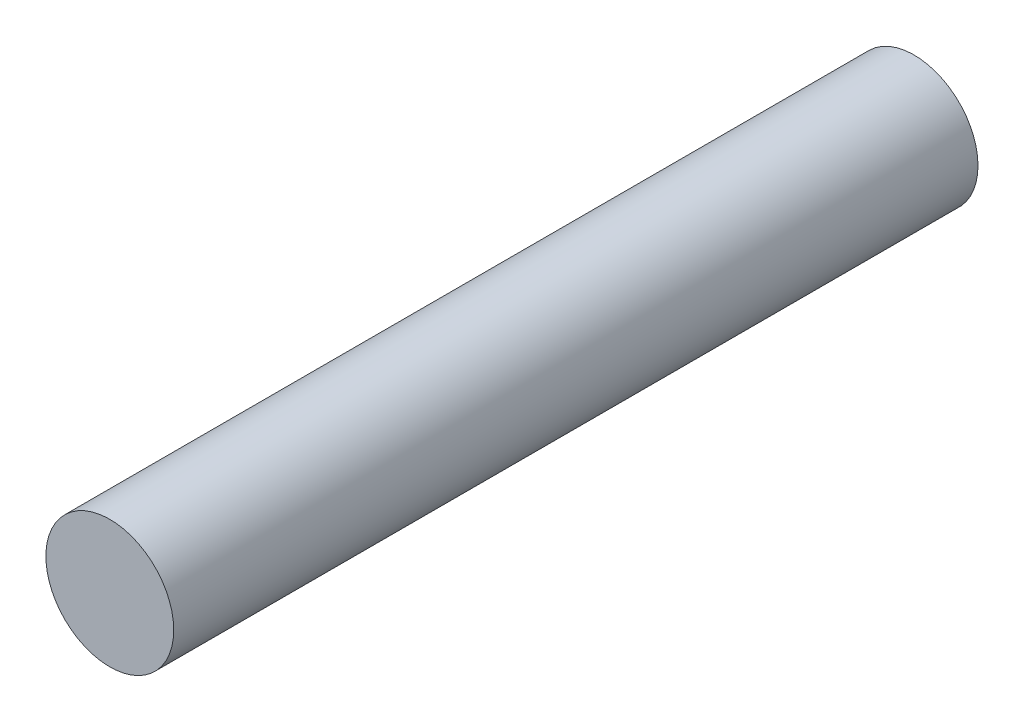
ISO-10303-21;
HEADER;
FILE_DESCRIPTION(('STEP AP214'),'2;1');
FILE_NAME('part.step','',(''),(''),'','','');
FILE_SCHEMA(('AUTOMOTIVE_DESIGN { 1 0 10303 214 1 1 1 1 }'));
ENDSEC;
DATA;
#1=APPLICATION_CONTEXT('core data for automotive mechanical design processes');
#2=APPLICATION_PROTOCOL_DEFINITION('international standard','automotive_design',2000,#1);
#3=PRODUCT_CONTEXT('',#1,'mechanical');
#4=PRODUCT('Part','Part','',(#3));
#5=PRODUCT_RELATED_PRODUCT_CATEGORY('part','',(#4));
#6=PRODUCT_DEFINITION_FORMATION('','',#4);
#7=PRODUCT_DEFINITION_CONTEXT('part definition',#1,'design');
#8=PRODUCT_DEFINITION('design','',#6,#7);
#9=PRODUCT_DEFINITION_SHAPE('','',#8);
#10=(LENGTH_UNIT() NAMED_UNIT(*) SI_UNIT(.MILLI.,.METRE.));
#11=(NAMED_UNIT(*) PLANE_ANGLE_UNIT() SI_UNIT($,.RADIAN.));
#12=(NAMED_UNIT(*) SI_UNIT($,.STERADIAN.) SOLID_ANGLE_UNIT());
#13=UNCERTAINTY_MEASURE_WITH_UNIT(LENGTH_MEASURE(1.E-05),#10,'distance_accuracy_value','');
#14=(GEOMETRIC_REPRESENTATION_CONTEXT(3) GLOBAL_UNCERTAINTY_ASSIGNED_CONTEXT((#13)) GLOBAL_UNIT_ASSIGNED_CONTEXT((#10,
#11,#12)) REPRESENTATION_CONTEXT('',''));
#15=CARTESIAN_POINT('',(0.,0.,0.));
#16=DIRECTION('',(0.,0.,1.));
#17=DIRECTION('',(1.,0.,0.));
#18=AXIS2_PLACEMENT_3D('',#15,#16,#17);
#19=CARTESIAN_POINT('',(0.,0.,1500.));
#20=DIRECTION('',(0.,0.,-1.));
#21=DIRECTION('',(-1.,0.,0.));
#22=AXIS2_PLACEMENT_3D('',#19,#20,#21);
#23=CYLINDRICAL_SURFACE('',#22,119.212160281835);
#24=CARTESIAN_POINT('',(0.,0.,1500.));
#25=DIRECTION('',(0.,0.,1.));
#26=DIRECTION('',(1.,0.,0.));
#27=AXIS2_PLACEMENT_3D('',#24,#25,#26);
#28=CIRCLE('',#27,119.212160281835);
#29=CARTESIAN_POINT('',(119.212160281835,0.,1500.));
#30=VERTEX_POINT('',#29);
#31=EDGE_CURVE('E10',#30,#30,#28,.T.);
#32=ORIENTED_EDGE('',*,*,#31,.F.);
#33=EDGE_LOOP('',(#32));
#34=FACE_BOUND('',#33,.T.);
#35=CARTESIAN_POINT('',(0.,0.,0.));
#36=DIRECTION('',(0.,0.,1.));
#37=DIRECTION('',(1.,0.,0.));
#38=AXIS2_PLACEMENT_3D('',#35,#36,#37);
#39=CIRCLE('',#38,119.212160281835);
#40=CARTESIAN_POINT('',(119.212160281835,0.,0.));
#41=VERTEX_POINT('',#40);
#42=EDGE_CURVE('E34',#41,#41,#39,.T.);
#43=ORIENTED_EDGE('',*,*,#42,.T.);
#44=EDGE_LOOP('',(#43));
#45=FACE_BOUND('',#44,.T.);
#46=ADVANCED_FACE('F31',(#34,#45),#23,.T.);
#47=CARTESIAN_POINT('',(0.,0.,1500.));
#48=DIRECTION('',(0.,0.,1.));
#49=DIRECTION('',(1.,0.,0.));
#50=AXIS2_PLACEMENT_3D('',#47,#48,#49);
#51=PLANE('',#50);
#52=ORIENTED_EDGE('',*,*,#31,.T.);
#53=EDGE_LOOP('',(#52));
#54=FACE_BOUND('',#53,.T.);
#55=ADVANCED_FACE('F46',(#54),#51,.T.);
#56=CARTESIAN_POINT('',(0.,0.,0.));
#57=DIRECTION('',(0.,0.,1.));
#58=DIRECTION('',(1.,0.,0.));
#59=AXIS2_PLACEMENT_3D('',#56,#57,#58);
#60=PLANE('',#59);
#61=ORIENTED_EDGE('',*,*,#42,.F.);
#62=EDGE_LOOP('',(#61));
#63=FACE_BOUND('',#62,.T.);
#64=ADVANCED_FACE('F44',(#63),#60,.F.);
#65=CLOSED_SHELL('',(#46,#55,#64));
#66=MANIFOLD_SOLID_BREP('B2',#65);
#67=ADVANCED_BREP_SHAPE_REPRESENTATION('',(#18,#66),#14);
#68=SHAPE_DEFINITION_REPRESENTATION(#9,#67);
ENDSEC;
END-ISO-10303-21;
